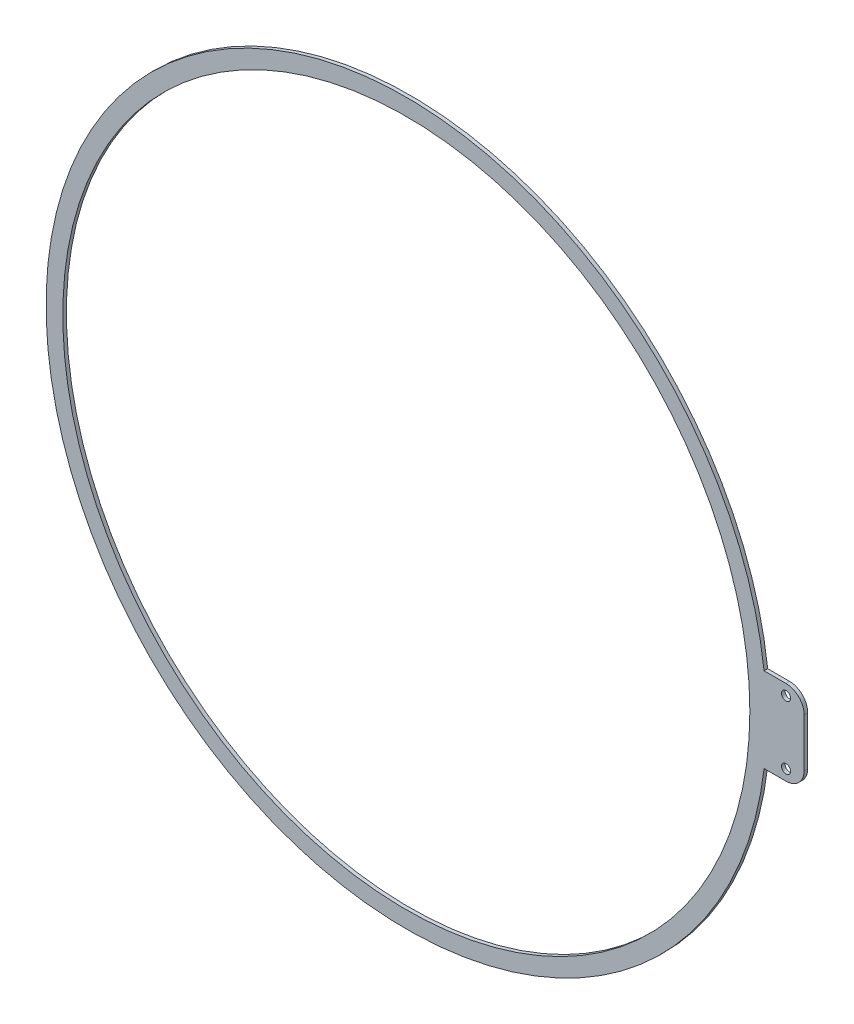
ISO-10303-21;
HEADER;
FILE_DESCRIPTION(('STEP AP214'),'2;1');
FILE_NAME('part.step','',(''),(''),'','','');
FILE_SCHEMA(('AUTOMOTIVE_DESIGN { 1 0 10303 214 1 1 1 1 }'));
ENDSEC;
DATA;
#1=APPLICATION_CONTEXT('core data for automotive mechanical design processes');
#2=APPLICATION_PROTOCOL_DEFINITION('international standard','automotive_design',2000,#1);
#3=PRODUCT_CONTEXT('',#1,'mechanical');
#4=PRODUCT('Part','Part','',(#3));
#5=PRODUCT_RELATED_PRODUCT_CATEGORY('part','',(#4));
#6=PRODUCT_DEFINITION_FORMATION('','',#4);
#7=PRODUCT_DEFINITION_CONTEXT('part definition',#1,'design');
#8=PRODUCT_DEFINITION('design','',#6,#7);
#9=PRODUCT_DEFINITION_SHAPE('','',#8);
#10=(LENGTH_UNIT() NAMED_UNIT(*) SI_UNIT(.MILLI.,.METRE.));
#11=(NAMED_UNIT(*) PLANE_ANGLE_UNIT() SI_UNIT($,.RADIAN.));
#12=(NAMED_UNIT(*) SI_UNIT($,.STERADIAN.) SOLID_ANGLE_UNIT());
#13=UNCERTAINTY_MEASURE_WITH_UNIT(LENGTH_MEASURE(1.E-05),#10,'distance_accuracy_value','');
#14=(GEOMETRIC_REPRESENTATION_CONTEXT(3) GLOBAL_UNCERTAINTY_ASSIGNED_CONTEXT((#13)) GLOBAL_UNIT_ASSIGNED_CONTEXT((#10,
#11,#12)) REPRESENTATION_CONTEXT('',''));
#15=CARTESIAN_POINT('',(0.,0.,0.));
#16=DIRECTION('',(0.,0.,1.));
#17=DIRECTION('',(1.,0.,0.));
#18=AXIS2_PLACEMENT_3D('',#15,#16,#17);
#19=CARTESIAN_POINT('',(-2.9776512183389E-13,11.7056154264851,1.));
#20=DIRECTION('',(0.,1.,0.));
#21=DIRECTION('',(-1.,0.,0.));
#22=AXIS2_PLACEMENT_3D('',#19,#20,#21);
#23=PLANE('',#22);
#24=DIRECTION('',(1.,0.,0.));
#25=VECTOR('',#24,1.);
#26=CARTESIAN_POINT('',(-2.9776512183389E-13,11.7056154264851,0.));
#27=LINE('',#26,#25);
#28=CARTESIAN_POINT('',(98.9306708848717,11.7056154264876,0.));
#29=VERTEX_POINT('',#28);
#30=CARTESIAN_POINT('',(105.,11.7056154264878,0.));
#31=VERTEX_POINT('',#30);
#32=EDGE_CURVE('E127',#29,#31,#27,.T.);
#33=ORIENTED_EDGE('',*,*,#32,.F.);
#34=DIRECTION('',(0.,0.,-1.));
#35=VECTOR('',#34,1.);
#36=CARTESIAN_POINT('',(98.9306708848717,11.7056154264876,1.));
#37=LINE('',#36,#35);
#38=CARTESIAN_POINT('',(98.9306708848717,11.7056154264876,1.));
#39=VERTEX_POINT('',#38);
#40=EDGE_CURVE('E11',#39,#29,#37,.T.);
#41=ORIENTED_EDGE('',*,*,#40,.F.);
#42=DIRECTION('',(1.,0.,0.));
#43=VECTOR('',#42,1.);
#44=CARTESIAN_POINT('',(-2.9776512183389E-13,11.7056154264851,1.));
#45=LINE('',#44,#43);
#46=CARTESIAN_POINT('',(105.,11.7056154264878,1.));
#47=VERTEX_POINT('',#46);
#48=EDGE_CURVE('E148',#39,#47,#45,.T.);
#49=ORIENTED_EDGE('',*,*,#48,.T.);
#50=DIRECTION('',(0.,0.,-1.));
#51=VECTOR('',#50,1.);
#52=CARTESIAN_POINT('',(105.,11.7056154264878,1.));
#53=LINE('',#52,#51);
#54=EDGE_CURVE('E79',#47,#31,#53,.T.);
#55=ORIENTED_EDGE('',*,*,#54,.T.);
#56=EDGE_LOOP('',(#33,#41,#49,#55));
#57=FACE_BOUND('',#56,.T.);
#58=ADVANCED_FACE('F35',(#57),#23,.T.);
#59=CARTESIAN_POINT('',(0.,0.,1.));
#60=DIRECTION('',(0.,0.,-1.));
#61=DIRECTION('',(-1.,0.,0.));
#62=AXIS2_PLACEMENT_3D('',#59,#60,#61);
#63=CYLINDRICAL_SURFACE('',#62,99.620776318214);
#64=CARTESIAN_POINT('',(0.,0.,0.));
#65=DIRECTION('',(0.,0.,1.));
#66=DIRECTION('',(1.,0.,0.));
#67=AXIS2_PLACEMENT_3D('',#64,#65,#66);
#68=CIRCLE('',#67,99.620776318214);
#69=CARTESIAN_POINT('',(98.9306708848716,-11.705615426488,0.));
#70=VERTEX_POINT('',#69);
#71=EDGE_CURVE('E130',#29,#70,#68,.T.);
#72=ORIENTED_EDGE('',*,*,#71,.T.);
#73=DIRECTION('',(0.,0.,-1.));
#74=VECTOR('',#73,1.);
#75=CARTESIAN_POINT('',(98.9306708848716,-11.705615426488,1.));
#76=LINE('',#75,#74);
#77=CARTESIAN_POINT('',(98.9306708848716,-11.705615426488,1.));
#78=VERTEX_POINT('',#77);
#79=EDGE_CURVE('E43',#78,#70,#76,.T.);
#80=ORIENTED_EDGE('',*,*,#79,.F.);
#81=CARTESIAN_POINT('',(0.,0.,1.));
#82=DIRECTION('',(0.,0.,1.));
#83=DIRECTION('',(1.,0.,0.));
#84=AXIS2_PLACEMENT_3D('',#81,#82,#83);
#85=CIRCLE('',#84,99.620776318214);
#86=EDGE_CURVE('E162',#39,#78,#85,.T.);
#87=ORIENTED_EDGE('',*,*,#86,.F.);
#88=ORIENTED_EDGE('',*,*,#40,.T.);
#89=EDGE_LOOP('',(#72,#80,#87,#88));
#90=FACE_BOUND('',#89,.T.);
#91=ADVANCED_FACE('F165',(#90),#63,.T.);
#92=CARTESIAN_POINT('',(0.,-11.7056154264882,1.));
#93=DIRECTION('',(0.,1.,0.));
#94=DIRECTION('',(-1.,0.,0.));
#95=AXIS2_PLACEMENT_3D('',#92,#93,#94);
#96=PLANE('',#95);
#97=DIRECTION('',(1.,0.,0.));
#98=VECTOR('',#97,1.);
#99=CARTESIAN_POINT('',(0.,-11.7056154264882,0.));
#100=LINE('',#99,#98);
#101=CARTESIAN_POINT('',(105.,-11.705615426488,0.));
#102=VERTEX_POINT('',#101);
#103=EDGE_CURVE('E132',#70,#102,#100,.T.);
#104=ORIENTED_EDGE('',*,*,#103,.T.);
#105=DIRECTION('',(0.,0.,-1.));
#106=VECTOR('',#105,1.);
#107=CARTESIAN_POINT('',(105.,-11.705615426488,1.));
#108=LINE('',#107,#106);
#109=CARTESIAN_POINT('',(105.,-11.705615426488,1.));
#110=VERTEX_POINT('',#109);
#111=EDGE_CURVE('E111',#110,#102,#108,.T.);
#112=ORIENTED_EDGE('',*,*,#111,.F.);
#113=DIRECTION('',(1.,0.,0.));
#114=VECTOR('',#113,1.);
#115=CARTESIAN_POINT('',(0.,-11.7056154264882,1.));
#116=LINE('',#115,#114);
#117=EDGE_CURVE('E98',#78,#110,#116,.T.);
#118=ORIENTED_EDGE('',*,*,#117,.F.);
#119=ORIENTED_EDGE('',*,*,#79,.T.);
#120=EDGE_LOOP('',(#104,#112,#118,#119));
#121=FACE_BOUND('',#120,.T.);
#122=ADVANCED_FACE('F155',(#121),#96,.F.);
#123=CARTESIAN_POINT('',(105.,-6.70561542648796,1.));
#124=DIRECTION('',(0.,0.,-1.));
#125=DIRECTION('',(-1.,0.,0.));
#126=AXIS2_PLACEMENT_3D('',#123,#124,#125);
#127=CYLINDRICAL_SURFACE('',#126,5.);
#128=CARTESIAN_POINT('',(105.,-6.70561542648796,0.));
#129=DIRECTION('',(0.,0.,1.));
#130=DIRECTION('',(1.,0.,0.));
#131=AXIS2_PLACEMENT_3D('',#128,#129,#130);
#132=CIRCLE('',#131,5.);
#133=CARTESIAN_POINT('',(110.,-6.70561542648793,0.));
#134=VERTEX_POINT('',#133);
#135=EDGE_CURVE('E107',#102,#134,#132,.T.);
#136=ORIENTED_EDGE('',*,*,#135,.T.);
#137=DIRECTION('',(0.,0.,-1.));
#138=VECTOR('',#137,1.);
#139=CARTESIAN_POINT('',(110.,-6.70561542648793,1.));
#140=LINE('',#139,#138);
#141=CARTESIAN_POINT('',(110.,-6.70561542648793,1.));
#142=VERTEX_POINT('',#141);
#143=EDGE_CURVE('E104',#142,#134,#140,.T.);
#144=ORIENTED_EDGE('',*,*,#143,.F.);
#145=CARTESIAN_POINT('',(105.,-6.70561542648796,1.));
#146=DIRECTION('',(0.,0.,1.));
#147=DIRECTION('',(1.,0.,0.));
#148=AXIS2_PLACEMENT_3D('',#145,#146,#147);
#149=CIRCLE('',#148,5.);
#150=EDGE_CURVE('E91',#110,#142,#149,.T.);
#151=ORIENTED_EDGE('',*,*,#150,.F.);
#152=ORIENTED_EDGE('',*,*,#111,.T.);
#153=EDGE_LOOP('',(#136,#144,#151,#152));
#154=FACE_BOUND('',#153,.T.);
#155=ADVANCED_FACE('F105',(#154),#127,.T.);
#156=CARTESIAN_POINT('',(110.,0.,1.));
#157=DIRECTION('',(1.,0.,0.));
#158=DIRECTION('',(0.,0.,-1.));
#159=AXIS2_PLACEMENT_3D('',#156,#157,#158);
#160=PLANE('',#159);
#161=DIRECTION('',(0.,-1.,0.));
#162=VECTOR('',#161,1.);
#163=CARTESIAN_POINT('',(110.,0.,0.));
#164=LINE('',#163,#162);
#165=CARTESIAN_POINT('',(110.,6.70561542648774,0.));
#166=VERTEX_POINT('',#165);
#167=EDGE_CURVE('E135',#166,#134,#164,.T.);
#168=ORIENTED_EDGE('',*,*,#167,.F.);
#169=DIRECTION('',(0.,0.,-1.));
#170=VECTOR('',#169,1.);
#171=CARTESIAN_POINT('',(110.,6.70561542648774,1.));
#172=LINE('',#171,#170);
#173=CARTESIAN_POINT('',(110.,6.70561542648774,1.));
#174=VERTEX_POINT('',#173);
#175=EDGE_CURVE('E72',#174,#166,#172,.T.);
#176=ORIENTED_EDGE('',*,*,#175,.F.);
#177=DIRECTION('',(0.,-1.,0.));
#178=VECTOR('',#177,1.);
#179=CARTESIAN_POINT('',(110.,0.,1.));
#180=LINE('',#179,#178);
#181=EDGE_CURVE('E96',#174,#142,#180,.T.);
#182=ORIENTED_EDGE('',*,*,#181,.T.);
#183=ORIENTED_EDGE('',*,*,#143,.T.);
#184=EDGE_LOOP('',(#168,#176,#182,#183));
#185=FACE_BOUND('',#184,.T.);
#186=ADVANCED_FACE('F113',(#185),#160,.T.);
#187=CARTESIAN_POINT('',(105.,8.75,1.));
#188=DIRECTION('',(0.,0.,-1.));
#189=DIRECTION('',(-1.,0.,0.));
#190=AXIS2_PLACEMENT_3D('',#187,#188,#189);
#191=CYLINDRICAL_SURFACE('',#190,1.25);
#192=CARTESIAN_POINT('',(105.,8.75,1.));
#193=DIRECTION('',(0.,0.,1.));
#194=DIRECTION('',(1.,0.,0.));
#195=AXIS2_PLACEMENT_3D('',#192,#193,#194);
#196=CIRCLE('',#195,1.25);
#197=CARTESIAN_POINT('',(106.25,8.75,1.));
#198=VERTEX_POINT('',#197);
#199=EDGE_CURVE('E121',#198,#198,#196,.T.);
#200=ORIENTED_EDGE('',*,*,#199,.T.);
#201=EDGE_LOOP('',(#200));
#202=FACE_BOUND('',#201,.T.);
#203=CARTESIAN_POINT('',(105.,8.75,0.));
#204=DIRECTION('',(0.,0.,1.));
#205=DIRECTION('',(1.,0.,0.));
#206=AXIS2_PLACEMENT_3D('',#203,#204,#205);
#207=CIRCLE('',#206,1.25);
#208=CARTESIAN_POINT('',(106.25,8.75,0.));
#209=VERTEX_POINT('',#208);
#210=EDGE_CURVE('E142',#209,#209,#207,.T.);
#211=ORIENTED_EDGE('',*,*,#210,.F.);
#212=EDGE_LOOP('',(#211));
#213=FACE_BOUND('',#212,.T.);
#214=ADVANCED_FACE('F177',(#202,#213),#191,.F.);
#215=CARTESIAN_POINT('',(0.,0.,1.));
#216=DIRECTION('',(0.,0.,-1.));
#217=DIRECTION('',(-1.,0.,0.));
#218=AXIS2_PLACEMENT_3D('',#215,#216,#217);
#219=CYLINDRICAL_SURFACE('',#218,95.);
#220=CARTESIAN_POINT('',(0.,0.,1.));
#221=DIRECTION('',(0.,0.,1.));
#222=DIRECTION('',(1.,0.,0.));
#223=AXIS2_PLACEMENT_3D('',#220,#221,#222);
#224=CIRCLE('',#223,95.);
#225=CARTESIAN_POINT('',(95.,0.,1.));
#226=VERTEX_POINT('',#225);
#227=EDGE_CURVE('E115',#226,#226,#224,.T.);
#228=ORIENTED_EDGE('',*,*,#227,.T.);
#229=EDGE_LOOP('',(#228));
#230=FACE_BOUND('',#229,.T.);
#231=CARTESIAN_POINT('',(0.,0.,0.));
#232=DIRECTION('',(0.,0.,1.));
#233=DIRECTION('',(1.,0.,0.));
#234=AXIS2_PLACEMENT_3D('',#231,#232,#233);
#235=CIRCLE('',#234,95.);
#236=CARTESIAN_POINT('',(95.,0.,0.));
#237=VERTEX_POINT('',#236);
#238=EDGE_CURVE('E139',#237,#237,#235,.T.);
#239=ORIENTED_EDGE('',*,*,#238,.F.);
#240=EDGE_LOOP('',(#239));
#241=FACE_BOUND('',#240,.T.);
#242=ADVANCED_FACE('F181',(#230,#241),#219,.F.);
#243=CARTESIAN_POINT('',(105.,6.70561542648777,1.));
#244=DIRECTION('',(0.,0.,-1.));
#245=DIRECTION('',(-1.,0.,0.));
#246=AXIS2_PLACEMENT_3D('',#243,#244,#245);
#247=CYLINDRICAL_SURFACE('',#246,5.);
#248=CARTESIAN_POINT('',(105.,6.70561542648777,0.));
#249=DIRECTION('',(0.,0.,1.));
#250=DIRECTION('',(1.,0.,0.));
#251=AXIS2_PLACEMENT_3D('',#248,#249,#250);
#252=CIRCLE('',#251,5.);
#253=EDGE_CURVE('E137',#166,#31,#252,.T.);
#254=ORIENTED_EDGE('',*,*,#253,.T.);
#255=ORIENTED_EDGE('',*,*,#54,.F.);
#256=CARTESIAN_POINT('',(105.,6.70561542648777,1.));
#257=DIRECTION('',(0.,0.,1.));
#258=DIRECTION('',(1.,0.,0.));
#259=AXIS2_PLACEMENT_3D('',#256,#257,#258);
#260=CIRCLE('',#259,5.);
#261=EDGE_CURVE('E51',#174,#47,#260,.T.);
#262=ORIENTED_EDGE('',*,*,#261,.F.);
#263=ORIENTED_EDGE('',*,*,#175,.T.);
#264=EDGE_LOOP('',(#254,#255,#262,#263));
#265=FACE_BOUND('',#264,.T.);
#266=ADVANCED_FACE('F161',(#265),#247,.T.);
#267=CARTESIAN_POINT('',(105.,-8.75,1.));
#268=DIRECTION('',(0.,0.,-1.));
#269=DIRECTION('',(-1.,0.,0.));
#270=AXIS2_PLACEMENT_3D('',#267,#268,#269);
#271=CYLINDRICAL_SURFACE('',#270,1.25);
#272=CARTESIAN_POINT('',(105.,-8.75,1.));
#273=DIRECTION('',(0.,0.,1.));
#274=DIRECTION('',(1.,0.,0.));
#275=AXIS2_PLACEMENT_3D('',#272,#273,#274);
#276=CIRCLE('',#275,1.25);
#277=CARTESIAN_POINT('',(106.25,-8.75,1.));
#278=VERTEX_POINT('',#277);
#279=EDGE_CURVE('E124',#278,#278,#276,.T.);
#280=ORIENTED_EDGE('',*,*,#279,.T.);
#281=EDGE_LOOP('',(#280));
#282=FACE_BOUND('',#281,.T.);
#283=CARTESIAN_POINT('',(105.,-8.75,0.));
#284=DIRECTION('',(0.,0.,1.));
#285=DIRECTION('',(1.,0.,0.));
#286=AXIS2_PLACEMENT_3D('',#283,#284,#285);
#287=CIRCLE('',#286,1.25);
#288=CARTESIAN_POINT('',(106.25,-8.75,0.));
#289=VERTEX_POINT('',#288);
#290=EDGE_CURVE('E145',#289,#289,#287,.T.);
#291=ORIENTED_EDGE('',*,*,#290,.F.);
#292=EDGE_LOOP('',(#291));
#293=FACE_BOUND('',#292,.T.);
#294=ADVANCED_FACE('F180',(#282,#293),#271,.F.);
#295=CARTESIAN_POINT('',(0.,0.,1.));
#296=DIRECTION('',(0.,0.,1.));
#297=DIRECTION('',(1.,0.,0.));
#298=AXIS2_PLACEMENT_3D('',#295,#296,#297);
#299=PLANE('',#298);
#300=ORIENTED_EDGE('',*,*,#48,.F.);
#301=ORIENTED_EDGE('',*,*,#86,.T.);
#302=ORIENTED_EDGE('',*,*,#117,.T.);
#303=ORIENTED_EDGE('',*,*,#150,.T.);
#304=ORIENTED_EDGE('',*,*,#181,.F.);
#305=ORIENTED_EDGE('',*,*,#261,.T.);
#306=EDGE_LOOP('',(#300,#301,#302,#303,#304,#305));
#307=FACE_BOUND('',#306,.T.);
#308=ORIENTED_EDGE('',*,*,#227,.F.);
#309=EDGE_LOOP('',(#308));
#310=FACE_BOUND('',#309,.T.);
#311=ORIENTED_EDGE('',*,*,#199,.F.);
#312=EDGE_LOOP('',(#311));
#313=FACE_BOUND('',#312,.T.);
#314=ORIENTED_EDGE('',*,*,#279,.F.);
#315=EDGE_LOOP('',(#314));
#316=FACE_BOUND('',#315,.T.);
#317=ADVANCED_FACE('F93',(#307,#310,#313,#316),#299,.T.);
#318=CARTESIAN_POINT('',(0.,0.,0.));
#319=DIRECTION('',(0.,0.,1.));
#320=DIRECTION('',(1.,0.,0.));
#321=AXIS2_PLACEMENT_3D('',#318,#319,#320);
#322=PLANE('',#321);
#323=ORIENTED_EDGE('',*,*,#32,.T.);
#324=ORIENTED_EDGE('',*,*,#253,.F.);
#325=ORIENTED_EDGE('',*,*,#167,.T.);
#326=ORIENTED_EDGE('',*,*,#135,.F.);
#327=ORIENTED_EDGE('',*,*,#103,.F.);
#328=ORIENTED_EDGE('',*,*,#71,.F.);
#329=EDGE_LOOP('',(#323,#324,#325,#326,#327,#328));
#330=FACE_BOUND('',#329,.T.);
#331=ORIENTED_EDGE('',*,*,#238,.T.);
#332=EDGE_LOOP('',(#331));
#333=FACE_BOUND('',#332,.T.);
#334=ORIENTED_EDGE('',*,*,#210,.T.);
#335=EDGE_LOOP('',(#334));
#336=FACE_BOUND('',#335,.T.);
#337=ORIENTED_EDGE('',*,*,#290,.T.);
#338=EDGE_LOOP('',(#337));
#339=FACE_BOUND('',#338,.T.);
#340=ADVANCED_FACE('F159',(#330,#333,#336,#339),#322,.F.);
#341=CLOSED_SHELL('',(#58,#91,#122,#155,#186,#214,#242,#266,#294,#317,#340));
#342=MANIFOLD_SOLID_BREP('B2',#341);
#343=ADVANCED_BREP_SHAPE_REPRESENTATION('',(#18,#342),#14);
#344=SHAPE_DEFINITION_REPRESENTATION(#9,#343);
ENDSEC;
END-ISO-10303-21;
